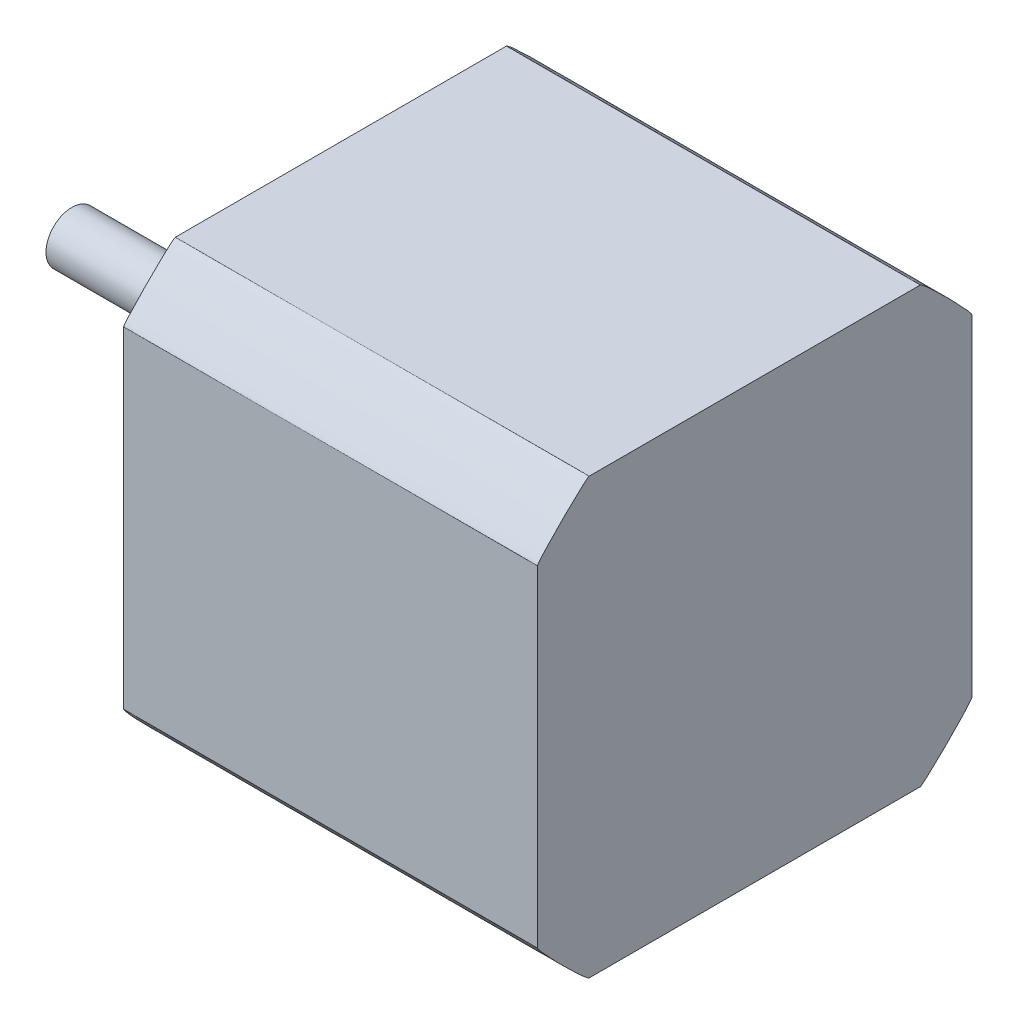
ISO-10303-21;
HEADER;
FILE_DESCRIPTION(('STEP AP214'),'2;1');
FILE_NAME('part.step','',(''),(''),'','','');
FILE_SCHEMA(('AUTOMOTIVE_DESIGN { 1 0 10303 214 1 1 1 1 }'));
ENDSEC;
DATA;
#1=APPLICATION_CONTEXT('core data for automotive mechanical design processes');
#2=APPLICATION_PROTOCOL_DEFINITION('international standard','automotive_design',2000,#1);
#3=PRODUCT_CONTEXT('',#1,'mechanical');
#4=PRODUCT('Part','Part','',(#3));
#5=PRODUCT_RELATED_PRODUCT_CATEGORY('part','',(#4));
#6=PRODUCT_DEFINITION_FORMATION('','',#4);
#7=PRODUCT_DEFINITION_CONTEXT('part definition',#1,'design');
#8=PRODUCT_DEFINITION('design','',#6,#7);
#9=PRODUCT_DEFINITION_SHAPE('','',#8);
#10=(LENGTH_UNIT() NAMED_UNIT(*) SI_UNIT(.MILLI.,.METRE.));
#11=(NAMED_UNIT(*) PLANE_ANGLE_UNIT() SI_UNIT($,.RADIAN.));
#12=(NAMED_UNIT(*) SI_UNIT($,.STERADIAN.) SOLID_ANGLE_UNIT());
#13=UNCERTAINTY_MEASURE_WITH_UNIT(LENGTH_MEASURE(1.E-05),#10,'distance_accuracy_value','');
#14=(GEOMETRIC_REPRESENTATION_CONTEXT(3) GLOBAL_UNCERTAINTY_ASSIGNED_CONTEXT((#13)) GLOBAL_UNIT_ASSIGNED_CONTEXT((#10,
#11,#12)) REPRESENTATION_CONTEXT('',''));
#15=CARTESIAN_POINT('',(0.,0.,0.));
#16=DIRECTION('',(0.,0.,1.));
#17=DIRECTION('',(1.,0.,0.));
#18=AXIS2_PLACEMENT_3D('',#15,#16,#17);
#19=CARTESIAN_POINT('',(40.,0.,0.));
#20=DIRECTION('',(0.,0.,-1.));
#21=DIRECTION('',(0.,1.,0.));
#22=AXIS2_PLACEMENT_3D('',#19,#20,#21);
#23=PLANE('',#22);
#24=DIRECTION('',(0.,-1.,0.));
#25=VECTOR('',#24,1.);
#26=CARTESIAN_POINT('',(0.,0.,0.));
#27=LINE('',#26,#25);
#28=CARTESIAN_POINT('',(0.,-5.,0.));
#29=VERTEX_POINT('',#28);
#30=CARTESIAN_POINT('',(0.,-37.,0.));
#31=VERTEX_POINT('',#30);
#32=EDGE_CURVE('E146',#29,#31,#27,.T.);
#33=ORIENTED_EDGE('',*,*,#32,.T.);
#34=CARTESIAN_POINT('',(42.,-37.,0.));
#35=CARTESIAN_POINT('',(27.3333333333333,-37.,0.));
#36=CARTESIAN_POINT('',(12.6666666666667,-37.,0.));
#37=CARTESIAN_POINT('',(-2.,-37.,0.));
#38=(BOUNDED_CURVE() B_SPLINE_CURVE(3,(#34,#35,#36,#37),.UNSPECIFIED.,.F.,
.F.) B_SPLINE_CURVE_WITH_KNOTS((4,4),(-0.002,0.042),
.UNSPECIFIED.) CURVE() GEOMETRIC_REPRESENTATION_ITEM() RATIONAL_B_SPLINE_CURVE((1.,1.,1.,1.)) REPRESENTATION_ITEM(''));
#39=CARTESIAN_POINT('',(40.,-37.,0.));
#40=VERTEX_POINT('',#39);
#41=EDGE_CURVE('E118',#31,#40,#38,.F.);
#42=ORIENTED_EDGE('',*,*,#41,.T.);
#43=DIRECTION('',(0.,-1.,0.));
#44=VECTOR('',#43,1.);
#45=CARTESIAN_POINT('',(40.,0.,0.));
#46=LINE('',#45,#44);
#47=CARTESIAN_POINT('',(40.,-5.,0.));
#48=VERTEX_POINT('',#47);
#49=EDGE_CURVE('E210',#48,#40,#46,.T.);
#50=ORIENTED_EDGE('',*,*,#49,.F.);
#51=CARTESIAN_POINT('',(-2.,-5.,0.));
#52=CARTESIAN_POINT('',(12.6666666666667,-5.,0.));
#53=CARTESIAN_POINT('',(27.3333333333333,-5.,0.));
#54=CARTESIAN_POINT('',(42.,-5.,0.));
#55=(BOUNDED_CURVE() B_SPLINE_CURVE(3,(#51,#52,#53,#54),.UNSPECIFIED.,.F.,
.F.) B_SPLINE_CURVE_WITH_KNOTS((4,4),(-0.002,0.042),
.UNSPECIFIED.) CURVE() GEOMETRIC_REPRESENTATION_ITEM() RATIONAL_B_SPLINE_CURVE((1.,1.,1.,1.)) REPRESENTATION_ITEM(''));
#56=EDGE_CURVE('E125',#48,#29,#55,.F.);
#57=ORIENTED_EDGE('',*,*,#56,.T.);
#58=EDGE_LOOP('',(#33,#42,#50,#57));
#59=FACE_BOUND('',#58,.T.);
#60=ADVANCED_FACE('F37',(#59),#23,.F.);
#61=CARTESIAN_POINT('',(40.,-42.,0.));
#62=DIRECTION('',(0.,1.,0.));
#63=DIRECTION('',(0.,0.,1.));
#64=AXIS2_PLACEMENT_3D('',#61,#62,#63);
#65=PLANE('',#64);
#66=DIRECTION('',(0.,0.,-1.));
#67=VECTOR('',#66,1.);
#68=CARTESIAN_POINT('',(40.,-42.,0.));
#69=LINE('',#68,#67);
#70=CARTESIAN_POINT('',(40.,-42.,-5.));
#71=VERTEX_POINT('',#70);
#72=CARTESIAN_POINT('',(40.,-42.,-37.));
#73=VERTEX_POINT('',#72);
#74=EDGE_CURVE('E137',#71,#73,#69,.T.);
#75=ORIENTED_EDGE('',*,*,#74,.F.);
#76=CARTESIAN_POINT('',(-2.,-42.,-5.));
#77=CARTESIAN_POINT('',(12.6666666666667,-42.,-5.));
#78=CARTESIAN_POINT('',(27.3333333333333,-42.,-5.));
#79=CARTESIAN_POINT('',(42.,-42.,-5.));
#80=(BOUNDED_CURVE() B_SPLINE_CURVE(3,(#76,#77,#78,#79),.UNSPECIFIED.,.F.,
.F.) B_SPLINE_CURVE_WITH_KNOTS((4,4),(-0.002,0.042),
.UNSPECIFIED.) CURVE() GEOMETRIC_REPRESENTATION_ITEM() RATIONAL_B_SPLINE_CURVE((1.,1.,1.,1.)) REPRESENTATION_ITEM(''));
#81=CARTESIAN_POINT('',(0.,-42.,-5.));
#82=VERTEX_POINT('',#81);
#83=EDGE_CURVE('E116',#71,#82,#80,.F.);
#84=ORIENTED_EDGE('',*,*,#83,.T.);
#85=DIRECTION('',(0.,0.,-1.));
#86=VECTOR('',#85,1.);
#87=CARTESIAN_POINT('',(0.,-42.,0.));
#88=LINE('',#87,#86);
#89=CARTESIAN_POINT('',(0.,-42.,-37.));
#90=VERTEX_POINT('',#89);
#91=EDGE_CURVE('E134',#82,#90,#88,.T.);
#92=ORIENTED_EDGE('',*,*,#91,.T.);
#93=CARTESIAN_POINT('',(42.,-42.,-37.));
#94=CARTESIAN_POINT('',(27.3333333333333,-42.,-37.));
#95=CARTESIAN_POINT('',(12.6666666666667,-42.,-37.));
#96=CARTESIAN_POINT('',(-2.,-42.,-37.));
#97=(BOUNDED_CURVE() B_SPLINE_CURVE(3,(#93,#94,#95,#96),.UNSPECIFIED.,.F.,
.F.) B_SPLINE_CURVE_WITH_KNOTS((4,4),(-0.002,0.042),
.UNSPECIFIED.) CURVE() GEOMETRIC_REPRESENTATION_ITEM() RATIONAL_B_SPLINE_CURVE((1.,1.,1.,1.)) REPRESENTATION_ITEM(''));
#98=EDGE_CURVE('E139',#90,#73,#97,.F.);
#99=ORIENTED_EDGE('',*,*,#98,.T.);
#100=EDGE_LOOP('',(#75,#84,#92,#99));
#101=FACE_BOUND('',#100,.T.);
#102=ADVANCED_FACE('F133',(#101),#65,.F.);
#103=CARTESIAN_POINT('',(40.,0.,-42.));
#104=DIRECTION('',(0.,0.,1.));
#105=DIRECTION('',(0.,-1.,0.));
#106=AXIS2_PLACEMENT_3D('',#103,#104,#105);
#107=PLANE('',#106);
#108=DIRECTION('',(0.,1.,0.));
#109=VECTOR('',#108,1.);
#110=CARTESIAN_POINT('',(40.,0.,-42.));
#111=LINE('',#110,#109);
#112=CARTESIAN_POINT('',(40.,-37.,-42.));
#113=VERTEX_POINT('',#112);
#114=CARTESIAN_POINT('',(40.,-5.,-42.));
#115=VERTEX_POINT('',#114);
#116=EDGE_CURVE('E229',#113,#115,#111,.T.);
#117=ORIENTED_EDGE('',*,*,#116,.F.);
#118=CARTESIAN_POINT('',(-2.,-37.,-42.));
#119=CARTESIAN_POINT('',(12.6666666666667,-37.,-42.));
#120=CARTESIAN_POINT('',(27.3333333333333,-37.,-42.));
#121=CARTESIAN_POINT('',(42.,-37.,-42.));
#122=(BOUNDED_CURVE() B_SPLINE_CURVE(3,(#118,#119,#120,#121),.UNSPECIFIED.,.F.,
.F.) B_SPLINE_CURVE_WITH_KNOTS((4,4),(-0.002,0.042),
.UNSPECIFIED.) CURVE() GEOMETRIC_REPRESENTATION_ITEM() RATIONAL_B_SPLINE_CURVE((1.,1.,1.,1.)) REPRESENTATION_ITEM(''));
#123=CARTESIAN_POINT('',(0.,-37.,-42.));
#124=VERTEX_POINT('',#123);
#125=EDGE_CURVE('E329',#113,#124,#122,.F.);
#126=ORIENTED_EDGE('',*,*,#125,.T.);
#127=DIRECTION('',(0.,1.,0.));
#128=VECTOR('',#127,1.);
#129=CARTESIAN_POINT('',(0.,0.,-42.));
#130=LINE('',#129,#128);
#131=CARTESIAN_POINT('',(0.,-5.,-42.));
#132=VERTEX_POINT('',#131);
#133=EDGE_CURVE('E145',#124,#132,#130,.T.);
#134=ORIENTED_EDGE('',*,*,#133,.T.);
#135=CARTESIAN_POINT('',(42.,-5.,-42.));
#136=CARTESIAN_POINT('',(27.3333333333333,-5.,-42.));
#137=CARTESIAN_POINT('',(12.6666666666667,-5.,-42.));
#138=CARTESIAN_POINT('',(-2.,-5.,-42.));
#139=(BOUNDED_CURVE() B_SPLINE_CURVE(3,(#135,#136,#137,#138),.UNSPECIFIED.,.F.,
.F.) B_SPLINE_CURVE_WITH_KNOTS((4,4),(-0.002,0.042),
.UNSPECIFIED.) CURVE() GEOMETRIC_REPRESENTATION_ITEM() RATIONAL_B_SPLINE_CURVE((1.,1.,1.,1.)) REPRESENTATION_ITEM(''));
#140=EDGE_CURVE('E283',#132,#115,#139,.F.);
#141=ORIENTED_EDGE('',*,*,#140,.T.);
#142=EDGE_LOOP('',(#117,#126,#134,#141));
#143=FACE_BOUND('',#142,.T.);
#144=ADVANCED_FACE('F289',(#143),#107,.F.);
#145=CARTESIAN_POINT('',(40.,0.,0.));
#146=DIRECTION('',(0.,-1.,0.));
#147=DIRECTION('',(0.,0.,-1.));
#148=AXIS2_PLACEMENT_3D('',#145,#146,#147);
#149=PLANE('',#148);
#150=DIRECTION('',(0.,0.,1.));
#151=VECTOR('',#150,1.);
#152=CARTESIAN_POINT('',(40.,0.,0.));
#153=LINE('',#152,#151);
#154=CARTESIAN_POINT('',(40.,0.,-37.));
#155=VERTEX_POINT('',#154);
#156=CARTESIAN_POINT('',(40.,0.,-5.));
#157=VERTEX_POINT('',#156);
#158=EDGE_CURVE('E232',#155,#157,#153,.T.);
#159=ORIENTED_EDGE('',*,*,#158,.F.);
#160=CARTESIAN_POINT('',(-2.,0.,-37.));
#161=CARTESIAN_POINT('',(12.6666666666667,0.,-37.));
#162=CARTESIAN_POINT('',(27.3333333333333,0.,-37.));
#163=CARTESIAN_POINT('',(42.,0.,-37.));
#164=(BOUNDED_CURVE() B_SPLINE_CURVE(3,(#160,#161,#162,#163),.UNSPECIFIED.,.F.,
.F.) B_SPLINE_CURVE_WITH_KNOTS((4,4),(-0.002,0.042),
.UNSPECIFIED.) CURVE() GEOMETRIC_REPRESENTATION_ITEM() RATIONAL_B_SPLINE_CURVE((1.,1.,1.,1.)) REPRESENTATION_ITEM(''));
#165=CARTESIAN_POINT('',(0.,0.,-37.));
#166=VERTEX_POINT('',#165);
#167=EDGE_CURVE('E12',#155,#166,#164,.F.);
#168=ORIENTED_EDGE('',*,*,#167,.T.);
#169=DIRECTION('',(0.,0.,1.));
#170=VECTOR('',#169,1.);
#171=CARTESIAN_POINT('',(0.,0.,0.));
#172=LINE('',#171,#170);
#173=CARTESIAN_POINT('',(0.,0.,-5.));
#174=VERTEX_POINT('',#173);
#175=EDGE_CURVE('E149',#166,#174,#172,.T.);
#176=ORIENTED_EDGE('',*,*,#175,.T.);
#177=CARTESIAN_POINT('',(42.,0.,-5.));
#178=CARTESIAN_POINT('',(27.3333333333333,0.,-5.));
#179=CARTESIAN_POINT('',(12.6666666666667,0.,-5.));
#180=CARTESIAN_POINT('',(-2.,0.,-5.));
#181=(BOUNDED_CURVE() B_SPLINE_CURVE(3,(#177,#178,#179,#180),.UNSPECIFIED.,.F.,
.F.) B_SPLINE_CURVE_WITH_KNOTS((4,4),(-0.002,0.042),
.UNSPECIFIED.) CURVE() GEOMETRIC_REPRESENTATION_ITEM() RATIONAL_B_SPLINE_CURVE((1.,1.,1.,1.)) REPRESENTATION_ITEM(''));
#182=EDGE_CURVE('E51',#174,#157,#181,.F.);
#183=ORIENTED_EDGE('',*,*,#182,.T.);
#184=EDGE_LOOP('',(#159,#168,#176,#183));
#185=FACE_BOUND('',#184,.T.);
#186=ADVANCED_FACE('F190',(#185),#149,.F.);
#187=CARTESIAN_POINT('',(40.,0.,0.));
#188=DIRECTION('',(1.,0.,0.));
#189=DIRECTION('',(0.,0.,-1.));
#190=AXIS2_PLACEMENT_3D('',#187,#188,#189);
#191=PLANE('',#190);
#192=ORIENTED_EDGE('',*,*,#49,.T.);
#193=CARTESIAN_POINT('',(40.,-42.,-5.));
#194=CARTESIAN_POINT('',(40.,-42.,0.));
#195=CARTESIAN_POINT('',(40.,-37.,0.));
#196=(BOUNDED_CURVE() B_SPLINE_CURVE(2,(#193,#194,#195),.UNSPECIFIED.,.F.,
.F.) B_SPLINE_CURVE_WITH_KNOTS((3,3),(0.,1.),
.UNSPECIFIED.) CURVE() GEOMETRIC_REPRESENTATION_ITEM() RATIONAL_B_SPLINE_CURVE((1.,
0.0526315789473684,1.)) REPRESENTATION_ITEM(''));
#197=EDGE_CURVE('E271',#40,#71,#196,.F.);
#198=ORIENTED_EDGE('',*,*,#197,.T.);
#199=ORIENTED_EDGE('',*,*,#74,.T.);
#200=CARTESIAN_POINT('',(40.,-37.,-42.));
#201=CARTESIAN_POINT('',(40.,-42.,-42.));
#202=CARTESIAN_POINT('',(40.,-42.,-37.));
#203=(BOUNDED_CURVE() B_SPLINE_CURVE(2,(#200,#201,#202),.UNSPECIFIED.,.F.,
.F.) B_SPLINE_CURVE_WITH_KNOTS((3,3),(0.,1.),
.UNSPECIFIED.) CURVE() GEOMETRIC_REPRESENTATION_ITEM() RATIONAL_B_SPLINE_CURVE((1.,
0.0526315789473684,1.)) REPRESENTATION_ITEM(''));
#204=EDGE_CURVE('E260',#73,#113,#203,.F.);
#205=ORIENTED_EDGE('',*,*,#204,.T.);
#206=ORIENTED_EDGE('',*,*,#116,.T.);
#207=CARTESIAN_POINT('',(40.,0.,-37.));
#208=CARTESIAN_POINT('',(40.,0.,-42.));
#209=CARTESIAN_POINT('',(40.,-5.,-42.));
#210=(BOUNDED_CURVE() B_SPLINE_CURVE(2,(#207,#208,#209),.UNSPECIFIED.,.F.,
.F.) B_SPLINE_CURVE_WITH_KNOTS((3,3),(0.,1.),
.UNSPECIFIED.) CURVE() GEOMETRIC_REPRESENTATION_ITEM() RATIONAL_B_SPLINE_CURVE((1.,
0.0526315789473684,1.)) REPRESENTATION_ITEM(''));
#211=EDGE_CURVE('E65',#115,#155,#210,.F.);
#212=ORIENTED_EDGE('',*,*,#211,.T.);
#213=ORIENTED_EDGE('',*,*,#158,.T.);
#214=CARTESIAN_POINT('',(40.,-5.,0.));
#215=CARTESIAN_POINT('',(40.,0.,0.));
#216=CARTESIAN_POINT('',(40.,0.,-5.));
#217=(BOUNDED_CURVE() B_SPLINE_CURVE(2,(#214,#215,#216),.UNSPECIFIED.,.F.,
.F.) B_SPLINE_CURVE_WITH_KNOTS((3,3),(0.,1.),
.UNSPECIFIED.) CURVE() GEOMETRIC_REPRESENTATION_ITEM() RATIONAL_B_SPLINE_CURVE((1.,
0.0526315789473684,1.)) REPRESENTATION_ITEM(''));
#218=EDGE_CURVE('E240',#157,#48,#217,.F.);
#219=ORIENTED_EDGE('',*,*,#218,.T.);
#220=EDGE_LOOP('',(#192,#198,#199,#205,#206,#212,#213,#219));
#221=FACE_BOUND('',#220,.T.);
#222=ADVANCED_FACE('F186',(#221),#191,.T.);
#223=CARTESIAN_POINT('',(0.,0.,0.));
#224=DIRECTION('',(1.,0.,0.));
#225=DIRECTION('',(0.,0.,-1.));
#226=AXIS2_PLACEMENT_3D('',#223,#224,#225);
#227=PLANE('',#226);
#228=CARTESIAN_POINT('',(0.,-5.5,-5.50000000000001));
#229=DIRECTION('',(-1.,0.,0.));
#230=DIRECTION('',(0.,0.,1.));
#231=AXIS2_PLACEMENT_3D('',#228,#229,#230);
#232=CIRCLE('',#231,1.5);
#233=CARTESIAN_POINT('',(0.,-5.5,-4.00000000000001));
#234=VERTEX_POINT('',#233);
#235=EDGE_CURVE('E675',#234,#234,#232,.T.);
#236=ORIENTED_EDGE('',*,*,#235,.F.);
#237=EDGE_LOOP('',(#236));
#238=FACE_BOUND('',#237,.T.);
#239=CARTESIAN_POINT('',(0.,-36.5,-5.49999999999969));
#240=DIRECTION('',(-1.,0.,0.));
#241=DIRECTION('',(0.,0.,1.));
#242=AXIS2_PLACEMENT_3D('',#239,#240,#241);
#243=CIRCLE('',#242,1.5);
#244=CARTESIAN_POINT('',(0.,-36.5,-3.99999999999968));
#245=VERTEX_POINT('',#244);
#246=EDGE_CURVE('E686',#245,#245,#243,.T.);
#247=ORIENTED_EDGE('',*,*,#246,.F.);
#248=EDGE_LOOP('',(#247));
#249=FACE_BOUND('',#248,.T.);
#250=CARTESIAN_POINT('',(0.,-36.5,-36.4999999999997));
#251=DIRECTION('',(-1.,0.,0.));
#252=DIRECTION('',(0.,0.,1.));
#253=AXIS2_PLACEMENT_3D('',#250,#251,#252);
#254=CIRCLE('',#253,1.5);
#255=CARTESIAN_POINT('',(0.,-36.5,-34.9999999999997));
#256=VERTEX_POINT('',#255);
#257=EDGE_CURVE('E692',#256,#256,#254,.T.);
#258=ORIENTED_EDGE('',*,*,#257,.F.);
#259=EDGE_LOOP('',(#258));
#260=FACE_BOUND('',#259,.T.);
#261=CARTESIAN_POINT('',(0.,-5.5,-36.5));
#262=DIRECTION('',(-1.,0.,0.));
#263=DIRECTION('',(0.,0.,1.));
#264=AXIS2_PLACEMENT_3D('',#261,#262,#263);
#265=CIRCLE('',#264,1.5);
#266=CARTESIAN_POINT('',(0.,-5.5,-35.));
#267=VERTEX_POINT('',#266);
#268=EDGE_CURVE('E674',#267,#267,#265,.T.);
#269=ORIENTED_EDGE('',*,*,#268,.F.);
#270=EDGE_LOOP('',(#269));
#271=FACE_BOUND('',#270,.T.);
#272=CARTESIAN_POINT('',(0.,-21.,-21.));
#273=DIRECTION('',(1.,0.,0.));
#274=DIRECTION('',(0.,0.,-1.));
#275=AXIS2_PLACEMENT_3D('',#272,#273,#274);
#276=CIRCLE('',#275,11.);
#277=CARTESIAN_POINT('',(0.,-21.,-32.));
#278=VERTEX_POINT('',#277);
#279=EDGE_CURVE('E156',#278,#278,#276,.F.);
#280=ORIENTED_EDGE('',*,*,#279,.F.);
#281=EDGE_LOOP('',(#280));
#282=FACE_BOUND('',#281,.T.);
#283=ORIENTED_EDGE('',*,*,#91,.F.);
#284=CARTESIAN_POINT('',(0.,-37.,0.));
#285=CARTESIAN_POINT('',(0.,-42.,0.));
#286=CARTESIAN_POINT('',(0.,-42.,-5.));
#287=(BOUNDED_CURVE() B_SPLINE_CURVE(2,(#284,#285,#286),.UNSPECIFIED.,.F.,
.F.) B_SPLINE_CURVE_WITH_KNOTS((3,3),(0.,1.),
.UNSPECIFIED.) CURVE() GEOMETRIC_REPRESENTATION_ITEM() RATIONAL_B_SPLINE_CURVE((1.,
0.0526315789473684,1.)) REPRESENTATION_ITEM(''));
#288=EDGE_CURVE('E111',#82,#31,#287,.F.);
#289=ORIENTED_EDGE('',*,*,#288,.T.);
#290=ORIENTED_EDGE('',*,*,#32,.F.);
#291=CARTESIAN_POINT('',(0.,0.,-5.));
#292=CARTESIAN_POINT('',(0.,0.,0.));
#293=CARTESIAN_POINT('',(0.,-5.,0.));
#294=(BOUNDED_CURVE() B_SPLINE_CURVE(2,(#291,#292,#293),.UNSPECIFIED.,.F.,
.F.) B_SPLINE_CURVE_WITH_KNOTS((3,3),(0.,1.),
.UNSPECIFIED.) CURVE() GEOMETRIC_REPRESENTATION_ITEM() RATIONAL_B_SPLINE_CURVE((1.,
0.0526315789473684,1.)) REPRESENTATION_ITEM(''));
#295=EDGE_CURVE('E138',#29,#174,#294,.F.);
#296=ORIENTED_EDGE('',*,*,#295,.T.);
#297=ORIENTED_EDGE('',*,*,#175,.F.);
#298=CARTESIAN_POINT('',(0.,-5.,-42.));
#299=CARTESIAN_POINT('',(0.,0.,-42.));
#300=CARTESIAN_POINT('',(0.,0.,-37.));
#301=(BOUNDED_CURVE() B_SPLINE_CURVE(2,(#298,#299,#300),.UNSPECIFIED.,.F.,
.F.) B_SPLINE_CURVE_WITH_KNOTS((3,3),(0.,1.),
.UNSPECIFIED.) CURVE() GEOMETRIC_REPRESENTATION_ITEM() RATIONAL_B_SPLINE_CURVE((1.,
0.0526315789473684,1.)) REPRESENTATION_ITEM(''));
#302=EDGE_CURVE('E326',#166,#132,#301,.F.);
#303=ORIENTED_EDGE('',*,*,#302,.T.);
#304=ORIENTED_EDGE('',*,*,#133,.F.);
#305=CARTESIAN_POINT('',(0.,-42.,-37.));
#306=CARTESIAN_POINT('',(0.,-42.,-42.));
#307=CARTESIAN_POINT('',(0.,-37.,-42.));
#308=(BOUNDED_CURVE() B_SPLINE_CURVE(2,(#305,#306,#307),.UNSPECIFIED.,.F.,
.F.) B_SPLINE_CURVE_WITH_KNOTS((3,3),(0.,1.),
.UNSPECIFIED.) CURVE() GEOMETRIC_REPRESENTATION_ITEM() RATIONAL_B_SPLINE_CURVE((1.,
0.0526315789473684,1.)) REPRESENTATION_ITEM(''));
#309=EDGE_CURVE('E126',#124,#90,#308,.F.);
#310=ORIENTED_EDGE('',*,*,#309,.T.);
#311=EDGE_LOOP('',(#283,#289,#290,#296,#297,#303,#304,#310));
#312=FACE_BOUND('',#311,.T.);
#313=ADVANCED_FACE('F142',(#238,#249,#260,#271,#282,#312),#227,.F.);
#314=CARTESIAN_POINT('',(-2.,-21.,-21.));
#315=DIRECTION('',(1.,0.,0.));
#316=DIRECTION('',(0.,0.,-1.));
#317=AXIS2_PLACEMENT_3D('',#314,#315,#316);
#318=CYLINDRICAL_SURFACE('',#317,11.);
#319=CARTESIAN_POINT('',(-2.,-21.,-21.));
#320=DIRECTION('',(-1.,0.,0.));
#321=DIRECTION('',(0.,0.,1.));
#322=AXIS2_PLACEMENT_3D('',#319,#320,#321);
#323=CIRCLE('',#322,11.);
#324=CARTESIAN_POINT('',(-2.,-21.,-10.));
#325=VERTEX_POINT('',#324);
#326=EDGE_CURVE('E151',#325,#325,#323,.T.);
#327=ORIENTED_EDGE('',*,*,#326,.F.);
#328=EDGE_LOOP('',(#327));
#329=FACE_BOUND('',#328,.T.);
#330=ORIENTED_EDGE('',*,*,#279,.T.);
#331=EDGE_LOOP('',(#330));
#332=FACE_BOUND('',#331,.T.);
#333=ADVANCED_FACE('F185',(#329,#332),#318,.T.);
#334=CARTESIAN_POINT('',(-2.,-21.,-21.));
#335=DIRECTION('',(-1.,0.,0.));
#336=DIRECTION('',(0.,0.,1.));
#337=AXIS2_PLACEMENT_3D('',#334,#335,#336);
#338=PLANE('',#337);
#339=CARTESIAN_POINT('',(-2.,-21.,-21.));
#340=DIRECTION('',(-1.,0.,0.));
#341=DIRECTION('',(0.,0.,1.));
#342=AXIS2_PLACEMENT_3D('',#339,#340,#341);
#343=CIRCLE('',#342,2.5);
#344=CARTESIAN_POINT('',(-2.,-21.,-18.5));
#345=VERTEX_POINT('',#344);
#346=EDGE_CURVE('E696',#345,#345,#343,.T.);
#347=ORIENTED_EDGE('',*,*,#346,.F.);
#348=EDGE_LOOP('',(#347));
#349=FACE_BOUND('',#348,.T.);
#350=ORIENTED_EDGE('',*,*,#326,.T.);
#351=EDGE_LOOP('',(#350));
#352=FACE_BOUND('',#351,.T.);
#353=ADVANCED_FACE('F522',(#349,#352),#338,.T.);
#354=CARTESIAN_POINT('',(-26.,-21.,-21.));
#355=DIRECTION('',(1.,0.,0.));
#356=DIRECTION('',(0.,0.,-1.));
#357=AXIS2_PLACEMENT_3D('',#354,#355,#356);
#358=CYLINDRICAL_SURFACE('',#357,2.5);
#359=CARTESIAN_POINT('',(-26.,-21.,-21.));
#360=DIRECTION('',(-1.,0.,0.));
#361=DIRECTION('',(0.,0.,1.));
#362=AXIS2_PLACEMENT_3D('',#359,#360,#361);
#363=CIRCLE('',#362,2.5);
#364=CARTESIAN_POINT('',(-26.,-21.,-18.5));
#365=VERTEX_POINT('',#364);
#366=EDGE_CURVE('E698',#365,#365,#363,.T.);
#367=ORIENTED_EDGE('',*,*,#366,.F.);
#368=EDGE_LOOP('',(#367));
#369=FACE_BOUND('',#368,.T.);
#370=ORIENTED_EDGE('',*,*,#346,.T.);
#371=EDGE_LOOP('',(#370));
#372=FACE_BOUND('',#371,.T.);
#373=ADVANCED_FACE('F529',(#369,#372),#358,.T.);
#374=CARTESIAN_POINT('',(-26.,-21.,-21.));
#375=DIRECTION('',(-1.,0.,0.));
#376=DIRECTION('',(0.,0.,1.));
#377=AXIS2_PLACEMENT_3D('',#374,#375,#376);
#378=PLANE('',#377);
#379=ORIENTED_EDGE('',*,*,#366,.T.);
#380=EDGE_LOOP('',(#379));
#381=FACE_BOUND('',#380,.T.);
#382=ADVANCED_FACE('F537',(#381),#378,.T.);
#383=CARTESIAN_POINT('',(4.5,-5.5,-36.5));
#384=DIRECTION('',(-1.,0.,0.));
#385=DIRECTION('',(0.,0.,1.));
#386=AXIS2_PLACEMENT_3D('',#383,#384,#385);
#387=CYLINDRICAL_SURFACE('',#386,1.5);
#388=CARTESIAN_POINT('',(4.5,-5.5,-36.5));
#389=DIRECTION('',(-1.,0.,0.));
#390=DIRECTION('',(0.,0.,1.));
#391=AXIS2_PLACEMENT_3D('',#388,#389,#390);
#392=CIRCLE('',#391,1.5);
#393=CARTESIAN_POINT('',(4.5,-5.5,-35.));
#394=VERTEX_POINT('',#393);
#395=EDGE_CURVE('E678',#394,#394,#392,.T.);
#396=ORIENTED_EDGE('',*,*,#395,.F.);
#397=EDGE_LOOP('',(#396));
#398=FACE_BOUND('',#397,.T.);
#399=ORIENTED_EDGE('',*,*,#268,.T.);
#400=EDGE_LOOP('',(#399));
#401=FACE_BOUND('',#400,.T.);
#402=ADVANCED_FACE('F545',(#398,#401),#387,.F.);
#403=CARTESIAN_POINT('',(4.5,-5.5,-36.5));
#404=DIRECTION('',(-1.,0.,0.));
#405=DIRECTION('',(0.,0.,1.));
#406=AXIS2_PLACEMENT_3D('',#403,#404,#405);
#407=PLANE('',#406);
#408=ORIENTED_EDGE('',*,*,#395,.T.);
#409=EDGE_LOOP('',(#408));
#410=FACE_BOUND('',#409,.T.);
#411=ADVANCED_FACE('F553',(#410),#407,.T.);
#412=CARTESIAN_POINT('',(4.5,-36.5,-36.4999999999997));
#413=DIRECTION('',(-1.,0.,0.));
#414=DIRECTION('',(0.,0.,1.));
#415=AXIS2_PLACEMENT_3D('',#412,#413,#414);
#416=CYLINDRICAL_SURFACE('',#415,1.5);
#417=CARTESIAN_POINT('',(4.5,-36.5,-36.4999999999997));
#418=DIRECTION('',(-1.,0.,0.));
#419=DIRECTION('',(0.,0.,1.));
#420=AXIS2_PLACEMENT_3D('',#417,#418,#419);
#421=CIRCLE('',#420,1.5);
#422=CARTESIAN_POINT('',(4.5,-36.5,-34.9999999999997));
#423=VERTEX_POINT('',#422);
#424=EDGE_CURVE('E689',#423,#423,#421,.T.);
#425=ORIENTED_EDGE('',*,*,#424,.F.);
#426=EDGE_LOOP('',(#425));
#427=FACE_BOUND('',#426,.T.);
#428=ORIENTED_EDGE('',*,*,#257,.T.);
#429=EDGE_LOOP('',(#428));
#430=FACE_BOUND('',#429,.T.);
#431=ADVANCED_FACE('F561',(#427,#430),#416,.F.);
#432=CARTESIAN_POINT('',(4.5,-36.5,-36.4999999999997));
#433=DIRECTION('',(-1.,0.,0.));
#434=DIRECTION('',(0.,0.,1.));
#435=AXIS2_PLACEMENT_3D('',#432,#433,#434);
#436=PLANE('',#435);
#437=ORIENTED_EDGE('',*,*,#424,.T.);
#438=EDGE_LOOP('',(#437));
#439=FACE_BOUND('',#438,.T.);
#440=ADVANCED_FACE('F569',(#439),#436,.T.);
#441=CARTESIAN_POINT('',(4.5,-36.5,-5.49999999999969));
#442=DIRECTION('',(-1.,0.,0.));
#443=DIRECTION('',(0.,0.,1.));
#444=AXIS2_PLACEMENT_3D('',#441,#442,#443);
#445=CYLINDRICAL_SURFACE('',#444,1.5);
#446=CARTESIAN_POINT('',(4.5,-36.5,-5.49999999999969));
#447=DIRECTION('',(-1.,0.,0.));
#448=DIRECTION('',(0.,0.,1.));
#449=AXIS2_PLACEMENT_3D('',#446,#447,#448);
#450=CIRCLE('',#449,1.5);
#451=CARTESIAN_POINT('',(4.5,-36.5,-3.99999999999968));
#452=VERTEX_POINT('',#451);
#453=EDGE_CURVE('E681',#452,#452,#450,.T.);
#454=ORIENTED_EDGE('',*,*,#453,.F.);
#455=EDGE_LOOP('',(#454));
#456=FACE_BOUND('',#455,.T.);
#457=ORIENTED_EDGE('',*,*,#246,.T.);
#458=EDGE_LOOP('',(#457));
#459=FACE_BOUND('',#458,.T.);
#460=ADVANCED_FACE('F577',(#456,#459),#445,.F.);
#461=CARTESIAN_POINT('',(4.5,-36.5,-5.49999999999969));
#462=DIRECTION('',(-1.,0.,0.));
#463=DIRECTION('',(0.,0.,1.));
#464=AXIS2_PLACEMENT_3D('',#461,#462,#463);
#465=PLANE('',#464);
#466=ORIENTED_EDGE('',*,*,#453,.T.);
#467=EDGE_LOOP('',(#466));
#468=FACE_BOUND('',#467,.T.);
#469=ADVANCED_FACE('F585',(#468),#465,.T.);
#470=CARTESIAN_POINT('',(4.5,-5.5,-5.50000000000001));
#471=DIRECTION('',(-1.,0.,0.));
#472=DIRECTION('',(0.,0.,1.));
#473=AXIS2_PLACEMENT_3D('',#470,#471,#472);
#474=CYLINDRICAL_SURFACE('',#473,1.5);
#475=CARTESIAN_POINT('',(4.5,-5.5,-5.50000000000001));
#476=DIRECTION('',(-1.,0.,0.));
#477=DIRECTION('',(0.,0.,1.));
#478=AXIS2_PLACEMENT_3D('',#475,#476,#477);
#479=CIRCLE('',#478,1.5);
#480=CARTESIAN_POINT('',(4.5,-5.5,-4.00000000000001));
#481=VERTEX_POINT('',#480);
#482=EDGE_CURVE('E673',#481,#481,#479,.T.);
#483=ORIENTED_EDGE('',*,*,#482,.F.);
#484=EDGE_LOOP('',(#483));
#485=FACE_BOUND('',#484,.T.);
#486=ORIENTED_EDGE('',*,*,#235,.T.);
#487=EDGE_LOOP('',(#486));
#488=FACE_BOUND('',#487,.T.);
#489=ADVANCED_FACE('F593',(#485,#488),#474,.F.);
#490=CARTESIAN_POINT('',(4.5,-5.5,-5.50000000000001));
#491=DIRECTION('',(-1.,0.,0.));
#492=DIRECTION('',(0.,0.,1.));
#493=AXIS2_PLACEMENT_3D('',#490,#491,#492);
#494=PLANE('',#493);
#495=ORIENTED_EDGE('',*,*,#482,.T.);
#496=EDGE_LOOP('',(#495));
#497=FACE_BOUND('',#496,.T.);
#498=ADVANCED_FACE('F437',(#497),#494,.T.);
#499=CARTESIAN_POINT('',(42.,-42.,-5.));
#500=CARTESIAN_POINT('',(27.3333333333333,-42.,-5.));
#501=CARTESIAN_POINT('',(12.6666666666667,-42.,-5.));
#502=CARTESIAN_POINT('',(-2.,-42.,-5.));
#503=CARTESIAN_POINT('',(42.,-42.,0.));
#504=CARTESIAN_POINT('',(27.3333333333333,-42.,0.));
#505=CARTESIAN_POINT('',(12.6666666666667,-42.,0.));
#506=CARTESIAN_POINT('',(-2.,-42.,0.));
#507=CARTESIAN_POINT('',(42.,-37.,0.));
#508=CARTESIAN_POINT('',(27.3333333333333,-37.,0.));
#509=CARTESIAN_POINT('',(12.6666666666667,-37.,0.));
#510=CARTESIAN_POINT('',(-2.,-37.,0.));
#511=(BOUNDED_SURFACE() B_SPLINE_SURFACE(2,3,((#499,#500,#501,#502),(#503,#504,#505,#506),(#507,
#508,#509,#510)),.UNSPECIFIED.,.F.,.F.,.F.) B_SPLINE_SURFACE_WITH_KNOTS((3,3),(4,4),(0.,1.),
(-0.002,0.042),.UNSPECIFIED.) GEOMETRIC_REPRESENTATION_ITEM() RATIONAL_B_SPLINE_SURFACE(((1.,1.,
1.,1.),(0.0526315789473684,0.0526315789473684,0.0526315789473684,0.0526315789473684),(1.,1.,1.,1.))) REPRESENTATION_ITEM('') SURFACE());
#512=ORIENTED_EDGE('',*,*,#197,.F.);
#513=ORIENTED_EDGE('',*,*,#41,.F.);
#514=ORIENTED_EDGE('',*,*,#288,.F.);
#515=ORIENTED_EDGE('',*,*,#83,.F.);
#516=EDGE_LOOP('',(#512,#513,#514,#515));
#517=FACE_BOUND('',#516,.T.);
#518=ADVANCED_FACE('F115',(#517),#511,.T.);
#519=CARTESIAN_POINT('',(42.,-37.,-42.));
#520=CARTESIAN_POINT('',(27.3333333333333,-37.,-42.));
#521=CARTESIAN_POINT('',(12.6666666666667,-37.,-42.));
#522=CARTESIAN_POINT('',(-2.,-37.,-42.));
#523=CARTESIAN_POINT('',(42.,-42.,-42.));
#524=CARTESIAN_POINT('',(27.3333333333333,-42.,-42.));
#525=CARTESIAN_POINT('',(12.6666666666667,-42.,-42.));
#526=CARTESIAN_POINT('',(-2.,-42.,-42.));
#527=CARTESIAN_POINT('',(42.,-42.,-37.));
#528=CARTESIAN_POINT('',(27.3333333333333,-42.,-37.));
#529=CARTESIAN_POINT('',(12.6666666666667,-42.,-37.));
#530=CARTESIAN_POINT('',(-2.,-42.,-37.));
#531=(BOUNDED_SURFACE() B_SPLINE_SURFACE(2,3,((#519,#520,#521,#522),(#523,#524,#525,#526),(#527,
#528,#529,#530)),.UNSPECIFIED.,.F.,.F.,.F.) B_SPLINE_SURFACE_WITH_KNOTS((3,3),(4,4),(0.,1.),
(-0.002,0.042),.UNSPECIFIED.) GEOMETRIC_REPRESENTATION_ITEM() RATIONAL_B_SPLINE_SURFACE(((1.,1.,
1.,1.),(0.0526315789473684,0.0526315789473684,0.0526315789473684,0.0526315789473684),(1.,1.,1.,1.))) REPRESENTATION_ITEM('') SURFACE());
#532=ORIENTED_EDGE('',*,*,#204,.F.);
#533=ORIENTED_EDGE('',*,*,#98,.F.);
#534=ORIENTED_EDGE('',*,*,#309,.F.);
#535=ORIENTED_EDGE('',*,*,#125,.F.);
#536=EDGE_LOOP('',(#532,#533,#534,#535));
#537=FACE_BOUND('',#536,.T.);
#538=ADVANCED_FACE('F355',(#537),#531,.T.);
#539=CARTESIAN_POINT('',(42.,0.,-37.));
#540=CARTESIAN_POINT('',(27.3333333333333,0.,-37.));
#541=CARTESIAN_POINT('',(12.6666666666667,0.,-37.));
#542=CARTESIAN_POINT('',(-2.,0.,-37.));
#543=CARTESIAN_POINT('',(42.,0.,-42.));
#544=CARTESIAN_POINT('',(27.3333333333333,0.,-42.));
#545=CARTESIAN_POINT('',(12.6666666666667,0.,-42.));
#546=CARTESIAN_POINT('',(-2.,0.,-42.));
#547=CARTESIAN_POINT('',(42.,-5.,-42.));
#548=CARTESIAN_POINT('',(27.3333333333333,-5.,-42.));
#549=CARTESIAN_POINT('',(12.6666666666667,-5.,-42.));
#550=CARTESIAN_POINT('',(-2.,-5.,-42.));
#551=(BOUNDED_SURFACE() B_SPLINE_SURFACE(2,3,((#539,#540,#541,#542),(#543,#544,#545,#546),(#547,
#548,#549,#550)),.UNSPECIFIED.,.F.,.F.,.F.) B_SPLINE_SURFACE_WITH_KNOTS((3,3),(4,4),(0.,1.),
(-0.002,0.042),.UNSPECIFIED.) GEOMETRIC_REPRESENTATION_ITEM() RATIONAL_B_SPLINE_SURFACE(((1.,1.,
1.,1.),(0.0526315789473684,0.0526315789473684,0.0526315789473684,0.0526315789473684),(1.,1.,1.,1.))) REPRESENTATION_ITEM('') SURFACE());
#552=ORIENTED_EDGE('',*,*,#211,.F.);
#553=ORIENTED_EDGE('',*,*,#140,.F.);
#554=ORIENTED_EDGE('',*,*,#302,.F.);
#555=ORIENTED_EDGE('',*,*,#167,.F.);
#556=EDGE_LOOP('',(#552,#553,#554,#555));
#557=FACE_BOUND('',#556,.T.);
#558=ADVANCED_FACE('F331',(#557),#551,.T.);
#559=CARTESIAN_POINT('',(42.,-5.,0.));
#560=CARTESIAN_POINT('',(27.3333333333333,-5.,0.));
#561=CARTESIAN_POINT('',(12.6666666666667,-5.,0.));
#562=CARTESIAN_POINT('',(-2.,-5.,0.));
#563=CARTESIAN_POINT('',(42.,0.,0.));
#564=CARTESIAN_POINT('',(27.3333333333333,0.,0.));
#565=CARTESIAN_POINT('',(12.6666666666667,0.,0.));
#566=CARTESIAN_POINT('',(-2.,0.,0.));
#567=CARTESIAN_POINT('',(42.,0.,-5.));
#568=CARTESIAN_POINT('',(27.3333333333333,0.,-5.));
#569=CARTESIAN_POINT('',(12.6666666666667,0.,-5.));
#570=CARTESIAN_POINT('',(-2.,0.,-5.));
#571=(BOUNDED_SURFACE() B_SPLINE_SURFACE(2,3,((#559,#560,#561,#562),(#563,#564,#565,#566),(#567,
#568,#569,#570)),.UNSPECIFIED.,.F.,.F.,.F.) B_SPLINE_SURFACE_WITH_KNOTS((3,3),(4,4),(0.,1.),
(-0.002,0.042),.UNSPECIFIED.) GEOMETRIC_REPRESENTATION_ITEM() RATIONAL_B_SPLINE_SURFACE(((1.,1.,
1.,1.),(0.0526315789473684,0.0526315789473684,0.0526315789473684,0.0526315789473684),(1.,1.,1.,1.))) REPRESENTATION_ITEM('') SURFACE());
#572=ORIENTED_EDGE('',*,*,#218,.F.);
#573=ORIENTED_EDGE('',*,*,#182,.F.);
#574=ORIENTED_EDGE('',*,*,#295,.F.);
#575=ORIENTED_EDGE('',*,*,#56,.F.);
#576=EDGE_LOOP('',(#572,#573,#574,#575));
#577=FACE_BOUND('',#576,.T.);
#578=ADVANCED_FACE('F40',(#577),#571,.T.);
#579=CLOSED_SHELL('',(#60,#102,#144,#186,#222,#313,#333,#353,#373,#382,#402,#411,#431,#440,#460,
#469,#489,#498,#518,#538,#558,#578));
#580=MANIFOLD_SOLID_BREP('B2',#579);
#581=ADVANCED_BREP_SHAPE_REPRESENTATION('',(#18,#580),#14);
#582=SHAPE_DEFINITION_REPRESENTATION(#9,#581);
ENDSEC;
END-ISO-10303-21;
